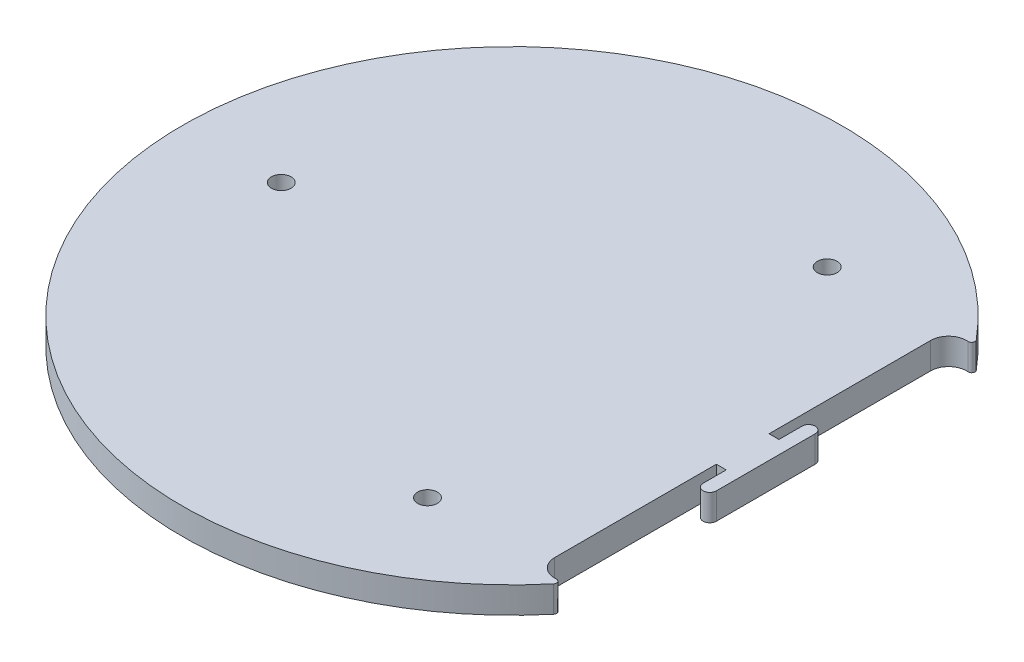
ISO-10303-21;
HEADER;
FILE_DESCRIPTION(('STEP AP214'),'2;1');
FILE_NAME('part.step','',(''),(''),'','','');
FILE_SCHEMA(('AUTOMOTIVE_DESIGN { 1 0 10303 214 1 1 1 1 }'));
ENDSEC;
DATA;
#1=APPLICATION_CONTEXT('core data for automotive mechanical design processes');
#2=APPLICATION_PROTOCOL_DEFINITION('international standard','automotive_design',2000,#1);
#3=PRODUCT_CONTEXT('',#1,'mechanical');
#4=PRODUCT('Part','Part','',(#3));
#5=PRODUCT_RELATED_PRODUCT_CATEGORY('part','',(#4));
#6=PRODUCT_DEFINITION_FORMATION('','',#4);
#7=PRODUCT_DEFINITION_CONTEXT('part definition',#1,'design');
#8=PRODUCT_DEFINITION('design','',#6,#7);
#9=PRODUCT_DEFINITION_SHAPE('','',#8);
#10=(LENGTH_UNIT() NAMED_UNIT(*) SI_UNIT(.MILLI.,.METRE.));
#11=(NAMED_UNIT(*) PLANE_ANGLE_UNIT() SI_UNIT($,.RADIAN.));
#12=(NAMED_UNIT(*) SI_UNIT($,.STERADIAN.) SOLID_ANGLE_UNIT());
#13=UNCERTAINTY_MEASURE_WITH_UNIT(LENGTH_MEASURE(1.E-05),#10,'distance_accuracy_value','');
#14=(GEOMETRIC_REPRESENTATION_CONTEXT(3) GLOBAL_UNCERTAINTY_ASSIGNED_CONTEXT((#13)) GLOBAL_UNIT_ASSIGNED_CONTEXT((#10,
#11,#12)) REPRESENTATION_CONTEXT('',''));
#15=CARTESIAN_POINT('',(0.,0.,0.));
#16=DIRECTION('',(0.,0.,1.));
#17=DIRECTION('',(1.,0.,0.));
#18=AXIS2_PLACEMENT_3D('',#15,#16,#17);
#19=CARTESIAN_POINT('',(0.,-2.,0.));
#20=DIRECTION('',(0.,1.,0.));
#21=DIRECTION('',(0.,0.,1.));
#22=AXIS2_PLACEMENT_3D('',#19,#20,#21);
#23=PLANE('',#22);
#24=DIRECTION('',(0.,0.,-1.));
#25=VECTOR('',#24,1.);
#26=CARTESIAN_POINT('',(38.5,-2.,0.));
#27=LINE('',#26,#25);
#28=CARTESIAN_POINT('',(38.5,-2.,7.5));
#29=VERTEX_POINT('',#28);
#30=CARTESIAN_POINT('',(38.5,-2.,-7.5));
#31=VERTEX_POINT('',#30);
#32=EDGE_CURVE('E168',#29,#31,#27,.T.);
#33=ORIENTED_EDGE('',*,*,#32,.F.);
#34=CARTESIAN_POINT('',(37.5,-2.,7.5));
#35=DIRECTION('',(0.,1.,0.));
#36=DIRECTION('',(0.,0.,1.));
#37=AXIS2_PLACEMENT_3D('',#34,#35,#36);
#38=CIRCLE('',#37,1.00000000000001);
#39=CARTESIAN_POINT('',(36.5,-2.,7.5));
#40=VERTEX_POINT('',#39);
#41=EDGE_CURVE('E101',#40,#29,#38,.T.);
#42=ORIENTED_EDGE('',*,*,#41,.F.);
#43=DIRECTION('',(0.,0.,-1.));
#44=VECTOR('',#43,1.);
#45=CARTESIAN_POINT('',(36.5,-2.,0.));
#46=LINE('',#45,#44);
#47=CARTESIAN_POINT('',(36.5,-2.,4.));
#48=VERTEX_POINT('',#47);
#49=EDGE_CURVE('E199',#40,#48,#46,.T.);
#50=ORIENTED_EDGE('',*,*,#49,.T.);
#51=DIRECTION('',(1.,0.,0.));
#52=VECTOR('',#51,1.);
#53=CARTESIAN_POINT('',(0.,-2.,4.));
#54=LINE('',#53,#52);
#55=CARTESIAN_POINT('',(35.,-2.,4.));
#56=VERTEX_POINT('',#55);
#57=EDGE_CURVE('E156',#56,#48,#54,.T.);
#58=ORIENTED_EDGE('',*,*,#57,.F.);
#59=DIRECTION('',(0.,0.,-1.));
#60=VECTOR('',#59,1.);
#61=CARTESIAN_POINT('',(35.,-2.,0.));
#62=LINE('',#61,#60);
#63=CARTESIAN_POINT('',(35.,-2.,28.5161138023531));
#64=VERTEX_POINT('',#63);
#65=EDGE_CURVE('E196',#64,#56,#62,.T.);
#66=ORIENTED_EDGE('',*,*,#65,.F.);
#67=CARTESIAN_POINT('',(37.7166544330073,-2.,28.5161138023531));
#68=DIRECTION('',(0.,1.,0.));
#69=DIRECTION('',(0.,0.,1.));
#70=AXIS2_PLACEMENT_3D('',#67,#68,#69);
#71=CIRCLE('',#70,2.71665443300733);
#72=CARTESIAN_POINT('',(37.9494092016024,-2.,31.2227790062664));
#73=VERTEX_POINT('',#72);
#74=EDGE_CURVE('E194',#73,#64,#71,.F.);
#75=ORIENTED_EDGE('',*,*,#74,.F.);
#76=CARTESIAN_POINT('',(37.9925630703769,-2.,31.7246079300356));
#77=DIRECTION('',(0.,1.,0.));
#78=DIRECTION('',(0.,0.,1.));
#79=AXIS2_PLACEMENT_3D('',#76,#77,#78);
#80=CIRCLE('',#79,0.503680975540726);
#81=CARTESIAN_POINT('',(38.3791803301599,-2.,32.0474416636503));
#82=VERTEX_POINT('',#81);
#83=EDGE_CURVE('E191',#73,#82,#80,.F.);
#84=ORIENTED_EDGE('',*,*,#83,.T.);
#85=CARTESIAN_POINT('',(0.,-2.,0.));
#86=DIRECTION('',(0.,1.,0.));
#87=DIRECTION('',(0.,0.,1.));
#88=AXIS2_PLACEMENT_3D('',#85,#86,#87);
#89=CIRCLE('',#88,50.);
#90=CARTESIAN_POINT('',(38.3791803301599,-2.,-32.0474416636503));
#91=VERTEX_POINT('',#90);
#92=EDGE_CURVE('E188',#91,#82,#89,.T.);
#93=ORIENTED_EDGE('',*,*,#92,.F.);
#94=CARTESIAN_POINT('',(37.9925630703769,-2.,-31.7246079300356));
#95=DIRECTION('',(0.,1.,0.));
#96=DIRECTION('',(0.,0.,1.));
#97=AXIS2_PLACEMENT_3D('',#94,#95,#96);
#98=CIRCLE('',#97,0.503680975540726);
#99=CARTESIAN_POINT('',(37.9494092016024,-2.,-31.2227790062663));
#100=VERTEX_POINT('',#99);
#101=EDGE_CURVE('E186',#100,#91,#98,.T.);
#102=ORIENTED_EDGE('',*,*,#101,.F.);
#103=CARTESIAN_POINT('',(37.7166544330073,-2.,-28.5161138023531));
#104=DIRECTION('',(0.,1.,0.));
#105=DIRECTION('',(0.,0.,1.));
#106=AXIS2_PLACEMENT_3D('',#103,#104,#105);
#107=CIRCLE('',#106,2.71665443300733);
#108=CARTESIAN_POINT('',(35.,-2.,-28.5161138023531));
#109=VERTEX_POINT('',#108);
#110=EDGE_CURVE('E183',#100,#109,#107,.T.);
#111=ORIENTED_EDGE('',*,*,#110,.T.);
#112=DIRECTION('',(0.,0.,-1.));
#113=VECTOR('',#112,1.);
#114=CARTESIAN_POINT('',(35.,-2.,0.));
#115=LINE('',#114,#113);
#116=CARTESIAN_POINT('',(35.,-2.,-4.));
#117=VERTEX_POINT('',#116);
#118=EDGE_CURVE('E180',#117,#109,#115,.T.);
#119=ORIENTED_EDGE('',*,*,#118,.F.);
#120=DIRECTION('',(1.,0.,0.));
#121=VECTOR('',#120,1.);
#122=CARTESIAN_POINT('',(0.,-2.,-4.));
#123=LINE('',#122,#121);
#124=CARTESIAN_POINT('',(36.5,-2.,-4.));
#125=VERTEX_POINT('',#124);
#126=EDGE_CURVE('E177',#117,#125,#123,.T.);
#127=ORIENTED_EDGE('',*,*,#126,.T.);
#128=DIRECTION('',(0.,0.,1.));
#129=VECTOR('',#128,1.);
#130=CARTESIAN_POINT('',(36.5,-2.,0.));
#131=LINE('',#130,#129);
#132=CARTESIAN_POINT('',(36.5,-2.,-7.5));
#133=VERTEX_POINT('',#132);
#134=EDGE_CURVE('E174',#133,#125,#131,.T.);
#135=ORIENTED_EDGE('',*,*,#134,.F.);
#136=CARTESIAN_POINT('',(37.5,-2.,-7.5));
#137=DIRECTION('',(0.,1.,0.));
#138=DIRECTION('',(0.,0.,1.));
#139=AXIS2_PLACEMENT_3D('',#136,#137,#138);
#140=CIRCLE('',#139,1.00000000000001);
#141=EDGE_CURVE('E171',#31,#133,#140,.T.);
#142=ORIENTED_EDGE('',*,*,#141,.F.);
#143=EDGE_LOOP('',(#33,#42,#50,#58,#66,#75,#84,#93,#102,#111,#119,#127,#135,#142));
#144=FACE_BOUND('',#143,.T.);
#145=CARTESIAN_POINT('',(-35.,-2.,0.));
#146=DIRECTION('',(0.,1.,0.));
#147=DIRECTION('',(0.,0.,1.));
#148=AXIS2_PLACEMENT_3D('',#145,#146,#147);
#149=CIRCLE('',#148,4.);
#150=CARTESIAN_POINT('',(-35.,-2.,4.));
#151=VERTEX_POINT('',#150);
#152=EDGE_CURVE('E229',#151,#151,#149,.F.);
#153=ORIENTED_EDGE('',*,*,#152,.F.);
#154=EDGE_LOOP('',(#153));
#155=FACE_BOUND('',#154,.T.);
#156=CARTESIAN_POINT('',(17.5,-2.,30.3108891324554));
#157=DIRECTION('',(0.,1.,0.));
#158=DIRECTION('',(0.,0.,1.));
#159=AXIS2_PLACEMENT_3D('',#156,#157,#158);
#160=CIRCLE('',#159,4.);
#161=CARTESIAN_POINT('',(17.5,-2.,34.3108891324554));
#162=VERTEX_POINT('',#161);
#163=EDGE_CURVE('E44',#162,#162,#160,.F.);
#164=ORIENTED_EDGE('',*,*,#163,.F.);
#165=EDGE_LOOP('',(#164));
#166=FACE_BOUND('',#165,.T.);
#167=CARTESIAN_POINT('',(17.5,-2.,-30.3108891324554));
#168=DIRECTION('',(0.,1.,0.));
#169=DIRECTION('',(0.,0.,1.));
#170=AXIS2_PLACEMENT_3D('',#167,#168,#169);
#171=CIRCLE('',#170,4.);
#172=CARTESIAN_POINT('',(17.5,-2.,-26.3108891324553));
#173=VERTEX_POINT('',#172);
#174=EDGE_CURVE('E11',#173,#173,#171,.F.);
#175=ORIENTED_EDGE('',*,*,#174,.F.);
#176=EDGE_LOOP('',(#175));
#177=FACE_BOUND('',#176,.T.);
#178=ADVANCED_FACE('F35',(#144,#155,#166,#177),#23,.F.);
#179=CARTESIAN_POINT('',(17.5,-2.,-30.3108891324554));
#180=DIRECTION('',(0.,-1.,0.));
#181=DIRECTION('',(0.,0.,-1.));
#182=AXIS2_PLACEMENT_3D('',#179,#180,#181);
#183=CIRCLE('',#182,3.);
#184=CARTESIAN_POINT('',(17.5,-2.,-33.3108891324554));
#185=VERTEX_POINT('',#184);
#186=EDGE_CURVE('E426',#185,#185,#183,.T.);
#187=ORIENTED_EDGE('',*,*,#186,.T.);
#188=EDGE_LOOP('',(#187));
#189=FACE_BOUND('',#188,.T.);
#190=CARTESIAN_POINT('',(17.5,-2.,-30.3108891324554));
#191=DIRECTION('',(0.,-1.,0.));
#192=DIRECTION('',(0.,0.,-1.));
#193=AXIS2_PLACEMENT_3D('',#190,#191,#192);
#194=CIRCLE('',#193,1.5);
#195=CARTESIAN_POINT('',(17.5,-2.,-31.8108891324553));
#196=VERTEX_POINT('',#195);
#197=EDGE_CURVE('E395',#196,#196,#194,.T.);
#198=ORIENTED_EDGE('',*,*,#197,.F.);
#199=EDGE_LOOP('',(#198));
#200=FACE_BOUND('',#199,.T.);
#201=ADVANCED_FACE('F238',(#189,#200),#23,.F.);
#202=CARTESIAN_POINT('',(17.5,-2.,30.3108891324554));
#203=DIRECTION('',(0.,-1.,0.));
#204=DIRECTION('',(0.,0.,-1.));
#205=AXIS2_PLACEMENT_3D('',#202,#203,#204);
#206=CIRCLE('',#205,2.99999999999999);
#207=CARTESIAN_POINT('',(17.5,-2.,27.3108891324554));
#208=VERTEX_POINT('',#207);
#209=EDGE_CURVE('E417',#208,#208,#206,.T.);
#210=ORIENTED_EDGE('',*,*,#209,.T.);
#211=EDGE_LOOP('',(#210));
#212=FACE_BOUND('',#211,.T.);
#213=CARTESIAN_POINT('',(17.5,-2.,30.3108891324554));
#214=DIRECTION('',(0.,-1.,0.));
#215=DIRECTION('',(0.,0.,-1.));
#216=AXIS2_PLACEMENT_3D('',#213,#214,#215);
#217=CIRCLE('',#216,1.5);
#218=CARTESIAN_POINT('',(17.5,-2.,28.8108891324554));
#219=VERTEX_POINT('',#218);
#220=EDGE_CURVE('E401',#219,#219,#217,.T.);
#221=ORIENTED_EDGE('',*,*,#220,.F.);
#222=EDGE_LOOP('',(#221));
#223=FACE_BOUND('',#222,.T.);
#224=ADVANCED_FACE('F301',(#212,#223),#23,.F.);
#225=CARTESIAN_POINT('',(38.5,2.,0.));
#226=DIRECTION('',(-1.,0.,0.));
#227=DIRECTION('',(0.,0.,1.));
#228=AXIS2_PLACEMENT_3D('',#225,#226,#227);
#229=PLANE('',#228);
#230=ORIENTED_EDGE('',*,*,#32,.T.);
#231=DIRECTION('',(0.,-1.,0.));
#232=VECTOR('',#231,1.);
#233=CARTESIAN_POINT('',(38.5,2.,-7.5));
#234=LINE('',#233,#232);
#235=CARTESIAN_POINT('',(38.5,2.,-7.5));
#236=VERTEX_POINT('',#235);
#237=EDGE_CURVE('E227',#236,#31,#234,.T.);
#238=ORIENTED_EDGE('',*,*,#237,.F.);
#239=DIRECTION('',(0.,0.,-1.));
#240=VECTOR('',#239,1.);
#241=CARTESIAN_POINT('',(38.5,2.,0.));
#242=LINE('',#241,#240);
#243=CARTESIAN_POINT('',(38.5,2.,7.5));
#244=VERTEX_POINT('',#243);
#245=EDGE_CURVE('E202',#244,#236,#242,.T.);
#246=ORIENTED_EDGE('',*,*,#245,.F.);
#247=DIRECTION('',(0.,-1.,0.));
#248=VECTOR('',#247,1.);
#249=CARTESIAN_POINT('',(38.5,2.,7.5));
#250=LINE('',#249,#248);
#251=EDGE_CURVE('E164',#244,#29,#250,.T.);
#252=ORIENTED_EDGE('',*,*,#251,.T.);
#253=EDGE_LOOP('',(#230,#238,#246,#252));
#254=FACE_BOUND('',#253,.T.);
#255=ADVANCED_FACE('F37',(#254),#229,.F.);
#256=CARTESIAN_POINT('',(37.5,2.,-7.5));
#257=DIRECTION('',(0.,-1.,0.));
#258=DIRECTION('',(0.,0.,-1.));
#259=AXIS2_PLACEMENT_3D('',#256,#257,#258);
#260=CYLINDRICAL_SURFACE('',#259,1.00000000000001);
#261=ORIENTED_EDGE('',*,*,#141,.T.);
#262=DIRECTION('',(0.,-1.,0.));
#263=VECTOR('',#262,1.);
#264=CARTESIAN_POINT('',(36.5,2.,-7.5));
#265=LINE('',#264,#263);
#266=CARTESIAN_POINT('',(36.5,2.,-7.5));
#267=VERTEX_POINT('',#266);
#268=EDGE_CURVE('E224',#267,#133,#265,.T.);
#269=ORIENTED_EDGE('',*,*,#268,.F.);
#270=CARTESIAN_POINT('',(37.5,2.,-7.5));
#271=DIRECTION('',(0.,1.,0.));
#272=DIRECTION('',(0.,0.,1.));
#273=AXIS2_PLACEMENT_3D('',#270,#271,#272);
#274=CIRCLE('',#273,1.00000000000001);
#275=EDGE_CURVE('E110',#236,#267,#274,.T.);
#276=ORIENTED_EDGE('',*,*,#275,.F.);
#277=ORIENTED_EDGE('',*,*,#237,.T.);
#278=EDGE_LOOP('',(#261,#269,#276,#277));
#279=FACE_BOUND('',#278,.T.);
#280=ADVANCED_FACE('F342',(#279),#260,.T.);
#281=CARTESIAN_POINT('',(36.5,2.,0.));
#282=DIRECTION('',(1.,0.,0.));
#283=DIRECTION('',(0.,0.,-1.));
#284=AXIS2_PLACEMENT_3D('',#281,#282,#283);
#285=PLANE('',#284);
#286=ORIENTED_EDGE('',*,*,#134,.T.);
#287=DIRECTION('',(0.,-1.,0.));
#288=VECTOR('',#287,1.);
#289=CARTESIAN_POINT('',(36.5,2.,-4.));
#290=LINE('',#289,#288);
#291=CARTESIAN_POINT('',(36.5,2.,-4.));
#292=VERTEX_POINT('',#291);
#293=EDGE_CURVE('E222',#292,#125,#290,.T.);
#294=ORIENTED_EDGE('',*,*,#293,.F.);
#295=DIRECTION('',(0.,0.,1.));
#296=VECTOR('',#295,1.);
#297=CARTESIAN_POINT('',(36.5,2.,0.));
#298=LINE('',#297,#296);
#299=EDGE_CURVE('E354',#267,#292,#298,.T.);
#300=ORIENTED_EDGE('',*,*,#299,.F.);
#301=ORIENTED_EDGE('',*,*,#268,.T.);
#302=EDGE_LOOP('',(#286,#294,#300,#301));
#303=FACE_BOUND('',#302,.T.);
#304=ADVANCED_FACE('F339',(#303),#285,.F.);
#305=CARTESIAN_POINT('',(0.,2.,-4.));
#306=DIRECTION('',(0.,0.,-1.));
#307=DIRECTION('',(-1.,0.,0.));
#308=AXIS2_PLACEMENT_3D('',#305,#306,#307);
#309=PLANE('',#308);
#310=ORIENTED_EDGE('',*,*,#126,.F.);
#311=DIRECTION('',(0.,-1.,0.));
#312=VECTOR('',#311,1.);
#313=CARTESIAN_POINT('',(35.,2.,-4.));
#314=LINE('',#313,#312);
#315=CARTESIAN_POINT('',(35.,2.,-4.));
#316=VERTEX_POINT('',#315);
#317=EDGE_CURVE('E220',#316,#117,#314,.T.);
#318=ORIENTED_EDGE('',*,*,#317,.F.);
#319=DIRECTION('',(1.,0.,0.));
#320=VECTOR('',#319,1.);
#321=CARTESIAN_POINT('',(0.,2.,-4.));
#322=LINE('',#321,#320);
#323=EDGE_CURVE('E361',#316,#292,#322,.T.);
#324=ORIENTED_EDGE('',*,*,#323,.T.);
#325=ORIENTED_EDGE('',*,*,#293,.T.);
#326=EDGE_LOOP('',(#310,#318,#324,#325));
#327=FACE_BOUND('',#326,.T.);
#328=ADVANCED_FACE('F335',(#327),#309,.T.);
#329=CARTESIAN_POINT('',(35.,2.,0.));
#330=DIRECTION('',(-1.,0.,0.));
#331=DIRECTION('',(0.,0.,1.));
#332=AXIS2_PLACEMENT_3D('',#329,#330,#331);
#333=PLANE('',#332);
#334=ORIENTED_EDGE('',*,*,#118,.T.);
#335=DIRECTION('',(0.,-1.,0.));
#336=VECTOR('',#335,1.);
#337=CARTESIAN_POINT('',(35.,2.,-28.5161138023531));
#338=LINE('',#337,#336);
#339=CARTESIAN_POINT('',(35.,2.,-28.5161138023531));
#340=VERTEX_POINT('',#339);
#341=EDGE_CURVE('E218',#340,#109,#338,.T.);
#342=ORIENTED_EDGE('',*,*,#341,.F.);
#343=DIRECTION('',(0.,0.,-1.));
#344=VECTOR('',#343,1.);
#345=CARTESIAN_POINT('',(35.,2.,0.));
#346=LINE('',#345,#344);
#347=EDGE_CURVE('E362',#316,#340,#346,.T.);
#348=ORIENTED_EDGE('',*,*,#347,.F.);
#349=ORIENTED_EDGE('',*,*,#317,.T.);
#350=EDGE_LOOP('',(#334,#342,#348,#349));
#351=FACE_BOUND('',#350,.T.);
#352=ADVANCED_FACE('F331',(#351),#333,.F.);
#353=CARTESIAN_POINT('',(37.7166544330073,2.,-28.5161138023531));
#354=DIRECTION('',(0.,-1.,0.));
#355=DIRECTION('',(0.,0.,-1.));
#356=AXIS2_PLACEMENT_3D('',#353,#354,#355);
#357=CYLINDRICAL_SURFACE('',#356,2.71665443300733);
#358=ORIENTED_EDGE('',*,*,#110,.F.);
#359=DIRECTION('',(0.,-1.,0.));
#360=VECTOR('',#359,1.);
#361=CARTESIAN_POINT('',(37.9494092016024,2.,-31.2227790062663));
#362=LINE('',#361,#360);
#363=CARTESIAN_POINT('',(37.9494092016024,2.,-31.2227790062663));
#364=VERTEX_POINT('',#363);
#365=EDGE_CURVE('E216',#364,#100,#362,.T.);
#366=ORIENTED_EDGE('',*,*,#365,.F.);
#367=CARTESIAN_POINT('',(37.7166544330073,2.,-28.5161138023531));
#368=DIRECTION('',(0.,1.,0.));
#369=DIRECTION('',(0.,0.,1.));
#370=AXIS2_PLACEMENT_3D('',#367,#368,#369);
#371=CIRCLE('',#370,2.71665443300733);
#372=EDGE_CURVE('E364',#364,#340,#371,.T.);
#373=ORIENTED_EDGE('',*,*,#372,.T.);
#374=ORIENTED_EDGE('',*,*,#341,.T.);
#375=EDGE_LOOP('',(#358,#366,#373,#374));
#376=FACE_BOUND('',#375,.T.);
#377=ADVANCED_FACE('F327',(#376),#357,.F.);
#378=CARTESIAN_POINT('',(37.9925630703769,2.,-31.7246079300356));
#379=DIRECTION('',(0.,-1.,0.));
#380=DIRECTION('',(0.,0.,-1.));
#381=AXIS2_PLACEMENT_3D('',#378,#379,#380);
#382=CYLINDRICAL_SURFACE('',#381,0.503680975540726);
#383=ORIENTED_EDGE('',*,*,#101,.T.);
#384=DIRECTION('',(0.,-1.,0.));
#385=VECTOR('',#384,1.);
#386=CARTESIAN_POINT('',(38.3791803301599,2.,-32.0474416636503));
#387=LINE('',#386,#385);
#388=CARTESIAN_POINT('',(38.3791803301599,2.,-32.0474416636503));
#389=VERTEX_POINT('',#388);
#390=EDGE_CURVE('E213',#389,#91,#387,.T.);
#391=ORIENTED_EDGE('',*,*,#390,.F.);
#392=CARTESIAN_POINT('',(37.9925630703769,2.,-31.7246079300356));
#393=DIRECTION('',(0.,1.,0.));
#394=DIRECTION('',(0.,0.,1.));
#395=AXIS2_PLACEMENT_3D('',#392,#393,#394);
#396=CIRCLE('',#395,0.503680975540726);
#397=EDGE_CURVE('E371',#364,#389,#396,.T.);
#398=ORIENTED_EDGE('',*,*,#397,.F.);
#399=ORIENTED_EDGE('',*,*,#365,.T.);
#400=EDGE_LOOP('',(#383,#391,#398,#399));
#401=FACE_BOUND('',#400,.T.);
#402=ADVANCED_FACE('F323',(#401),#382,.T.);
#403=CARTESIAN_POINT('',(0.,2.,0.));
#404=DIRECTION('',(0.,-1.,0.));
#405=DIRECTION('',(0.,0.,-1.));
#406=AXIS2_PLACEMENT_3D('',#403,#404,#405);
#407=CYLINDRICAL_SURFACE('',#406,50.);
#408=ORIENTED_EDGE('',*,*,#92,.T.);
#409=DIRECTION('',(0.,-1.,0.));
#410=VECTOR('',#409,1.);
#411=CARTESIAN_POINT('',(38.3791803301599,2.,32.0474416636503));
#412=LINE('',#411,#410);
#413=CARTESIAN_POINT('',(38.3791803301599,2.,32.0474416636503));
#414=VERTEX_POINT('',#413);
#415=EDGE_CURVE('E211',#414,#82,#412,.T.);
#416=ORIENTED_EDGE('',*,*,#415,.F.);
#417=CARTESIAN_POINT('',(0.,2.,0.));
#418=DIRECTION('',(0.,1.,0.));
#419=DIRECTION('',(0.,0.,1.));
#420=AXIS2_PLACEMENT_3D('',#417,#418,#419);
#421=CIRCLE('',#420,50.);
#422=EDGE_CURVE('E373',#389,#414,#421,.T.);
#423=ORIENTED_EDGE('',*,*,#422,.F.);
#424=ORIENTED_EDGE('',*,*,#390,.T.);
#425=EDGE_LOOP('',(#408,#416,#423,#424));
#426=FACE_BOUND('',#425,.T.);
#427=ADVANCED_FACE('F319',(#426),#407,.T.);
#428=CARTESIAN_POINT('',(37.9925630703769,2.,31.7246079300356));
#429=DIRECTION('',(0.,-1.,0.));
#430=DIRECTION('',(0.,0.,-1.));
#431=AXIS2_PLACEMENT_3D('',#428,#429,#430);
#432=CYLINDRICAL_SURFACE('',#431,0.503680975540726);
#433=ORIENTED_EDGE('',*,*,#83,.F.);
#434=DIRECTION('',(0.,-1.,0.));
#435=VECTOR('',#434,1.);
#436=CARTESIAN_POINT('',(37.9494092016024,2.,31.2227790062664));
#437=LINE('',#436,#435);
#438=CARTESIAN_POINT('',(37.9494092016024,2.,31.2227790062664));
#439=VERTEX_POINT('',#438);
#440=EDGE_CURVE('E209',#439,#73,#437,.T.);
#441=ORIENTED_EDGE('',*,*,#440,.F.);
#442=CARTESIAN_POINT('',(37.9925630703769,2.,31.7246079300356));
#443=DIRECTION('',(0.,1.,0.));
#444=DIRECTION('',(0.,0.,1.));
#445=AXIS2_PLACEMENT_3D('',#442,#443,#444);
#446=CIRCLE('',#445,0.503680975540726);
#447=EDGE_CURVE('E375',#439,#414,#446,.F.);
#448=ORIENTED_EDGE('',*,*,#447,.T.);
#449=ORIENTED_EDGE('',*,*,#415,.T.);
#450=EDGE_LOOP('',(#433,#441,#448,#449));
#451=FACE_BOUND('',#450,.T.);
#452=ADVANCED_FACE('F315',(#451),#432,.T.);
#453=CARTESIAN_POINT('',(37.7166544330073,2.,28.5161138023531));
#454=DIRECTION('',(0.,-1.,0.));
#455=DIRECTION('',(0.,0.,-1.));
#456=AXIS2_PLACEMENT_3D('',#453,#454,#455);
#457=CYLINDRICAL_SURFACE('',#456,2.71665443300733);
#458=ORIENTED_EDGE('',*,*,#74,.T.);
#459=DIRECTION('',(0.,-1.,0.));
#460=VECTOR('',#459,1.);
#461=CARTESIAN_POINT('',(35.,2.,28.5161138023531));
#462=LINE('',#461,#460);
#463=CARTESIAN_POINT('',(35.,2.,28.5161138023531));
#464=VERTEX_POINT('',#463);
#465=EDGE_CURVE('E206',#464,#64,#462,.T.);
#466=ORIENTED_EDGE('',*,*,#465,.F.);
#467=CARTESIAN_POINT('',(37.7166544330073,2.,28.5161138023531));
#468=DIRECTION('',(0.,1.,0.));
#469=DIRECTION('',(0.,0.,1.));
#470=AXIS2_PLACEMENT_3D('',#467,#468,#469);
#471=CIRCLE('',#470,2.71665443300733);
#472=EDGE_CURVE('E378',#439,#464,#471,.F.);
#473=ORIENTED_EDGE('',*,*,#472,.F.);
#474=ORIENTED_EDGE('',*,*,#440,.T.);
#475=EDGE_LOOP('',(#458,#466,#473,#474));
#476=FACE_BOUND('',#475,.T.);
#477=ADVANCED_FACE('F311',(#476),#457,.F.);
#478=CARTESIAN_POINT('',(35.,2.,0.));
#479=DIRECTION('',(-1.,0.,0.));
#480=DIRECTION('',(0.,0.,1.));
#481=AXIS2_PLACEMENT_3D('',#478,#479,#480);
#482=PLANE('',#481);
#483=ORIENTED_EDGE('',*,*,#65,.T.);
#484=DIRECTION('',(0.,-1.,0.));
#485=VECTOR('',#484,1.);
#486=CARTESIAN_POINT('',(35.,2.,4.));
#487=LINE('',#486,#485);
#488=CARTESIAN_POINT('',(35.,2.,4.));
#489=VERTEX_POINT('',#488);
#490=EDGE_CURVE('E160',#489,#56,#487,.T.);
#491=ORIENTED_EDGE('',*,*,#490,.F.);
#492=DIRECTION('',(0.,0.,-1.));
#493=VECTOR('',#492,1.);
#494=CARTESIAN_POINT('',(35.,2.,0.));
#495=LINE('',#494,#493);
#496=EDGE_CURVE('E147',#464,#489,#495,.T.);
#497=ORIENTED_EDGE('',*,*,#496,.F.);
#498=ORIENTED_EDGE('',*,*,#465,.T.);
#499=EDGE_LOOP('',(#483,#491,#497,#498));
#500=FACE_BOUND('',#499,.T.);
#501=ADVANCED_FACE('F308',(#500),#482,.F.);
#502=CARTESIAN_POINT('',(0.,2.,4.));
#503=DIRECTION('',(0.,0.,-1.));
#504=DIRECTION('',(-1.,0.,0.));
#505=AXIS2_PLACEMENT_3D('',#502,#503,#504);
#506=PLANE('',#505);
#507=ORIENTED_EDGE('',*,*,#57,.T.);
#508=DIRECTION('',(0.,-1.,0.));
#509=VECTOR('',#508,1.);
#510=CARTESIAN_POINT('',(36.5,2.,4.));
#511=LINE('',#510,#509);
#512=CARTESIAN_POINT('',(36.5,2.,4.));
#513=VERTEX_POINT('',#512);
#514=EDGE_CURVE('E153',#513,#48,#511,.T.);
#515=ORIENTED_EDGE('',*,*,#514,.F.);
#516=DIRECTION('',(1.,0.,0.));
#517=VECTOR('',#516,1.);
#518=CARTESIAN_POINT('',(0.,2.,4.));
#519=LINE('',#518,#517);
#520=EDGE_CURVE('E141',#489,#513,#519,.T.);
#521=ORIENTED_EDGE('',*,*,#520,.F.);
#522=ORIENTED_EDGE('',*,*,#490,.T.);
#523=EDGE_LOOP('',(#507,#515,#521,#522));
#524=FACE_BOUND('',#523,.T.);
#525=ADVANCED_FACE('F154',(#524),#506,.F.);
#526=CARTESIAN_POINT('',(36.5,2.,0.));
#527=DIRECTION('',(-1.,0.,0.));
#528=DIRECTION('',(0.,0.,1.));
#529=AXIS2_PLACEMENT_3D('',#526,#527,#528);
#530=PLANE('',#529);
#531=ORIENTED_EDGE('',*,*,#49,.F.);
#532=DIRECTION('',(0.,-1.,0.));
#533=VECTOR('',#532,1.);
#534=CARTESIAN_POINT('',(36.5,2.,7.5));
#535=LINE('',#534,#533);
#536=CARTESIAN_POINT('',(36.5,2.,7.5));
#537=VERTEX_POINT('',#536);
#538=EDGE_CURVE('E98',#537,#40,#535,.T.);
#539=ORIENTED_EDGE('',*,*,#538,.F.);
#540=DIRECTION('',(0.,0.,-1.));
#541=VECTOR('',#540,1.);
#542=CARTESIAN_POINT('',(36.5,2.,0.));
#543=LINE('',#542,#541);
#544=EDGE_CURVE('E145',#537,#513,#543,.T.);
#545=ORIENTED_EDGE('',*,*,#544,.T.);
#546=ORIENTED_EDGE('',*,*,#514,.T.);
#547=EDGE_LOOP('',(#531,#539,#545,#546));
#548=FACE_BOUND('',#547,.T.);
#549=ADVANCED_FACE('F162',(#548),#530,.T.);
#550=CARTESIAN_POINT('',(37.5,2.,7.5));
#551=DIRECTION('',(0.,-1.,0.));
#552=DIRECTION('',(0.,0.,-1.));
#553=AXIS2_PLACEMENT_3D('',#550,#551,#552);
#554=CYLINDRICAL_SURFACE('',#553,1.00000000000001);
#555=ORIENTED_EDGE('',*,*,#41,.T.);
#556=ORIENTED_EDGE('',*,*,#251,.F.);
#557=CARTESIAN_POINT('',(37.5,2.,7.5));
#558=DIRECTION('',(0.,1.,0.));
#559=DIRECTION('',(0.,0.,1.));
#560=AXIS2_PLACEMENT_3D('',#557,#558,#559);
#561=CIRCLE('',#560,1.00000000000001);
#562=EDGE_CURVE('E52',#537,#244,#561,.T.);
#563=ORIENTED_EDGE('',*,*,#562,.F.);
#564=ORIENTED_EDGE('',*,*,#538,.T.);
#565=EDGE_LOOP('',(#555,#556,#563,#564));
#566=FACE_BOUND('',#565,.T.);
#567=ADVANCED_FACE('F296',(#566),#554,.T.);
#568=CARTESIAN_POINT('',(0.,2.,0.));
#569=DIRECTION('',(0.,1.,0.));
#570=DIRECTION('',(0.,0.,1.));
#571=AXIS2_PLACEMENT_3D('',#568,#569,#570);
#572=PLANE('',#571);
#573=CARTESIAN_POINT('',(17.5,2.,30.3108891324554));
#574=DIRECTION('',(0.,1.,0.));
#575=DIRECTION('',(0.,0.,1.));
#576=AXIS2_PLACEMENT_3D('',#573,#574,#575);
#577=CIRCLE('',#576,1.5);
#578=CARTESIAN_POINT('',(17.5,2.,31.8108891324554));
#579=VERTEX_POINT('',#578);
#580=EDGE_CURVE('E398',#579,#579,#577,.T.);
#581=ORIENTED_EDGE('',*,*,#580,.F.);
#582=EDGE_LOOP('',(#581));
#583=FACE_BOUND('',#582,.T.);
#584=CARTESIAN_POINT('',(17.5,2.,-30.3108891324554));
#585=DIRECTION('',(0.,1.,0.));
#586=DIRECTION('',(0.,0.,1.));
#587=AXIS2_PLACEMENT_3D('',#584,#585,#586);
#588=CIRCLE('',#587,1.5);
#589=CARTESIAN_POINT('',(17.5,2.,-28.8108891324553));
#590=VERTEX_POINT('',#589);
#591=EDGE_CURVE('E392',#590,#590,#588,.T.);
#592=ORIENTED_EDGE('',*,*,#591,.F.);
#593=EDGE_LOOP('',(#592));
#594=FACE_BOUND('',#593,.T.);
#595=CARTESIAN_POINT('',(-35.,2.,0.));
#596=DIRECTION('',(0.,1.,0.));
#597=DIRECTION('',(0.,0.,1.));
#598=AXIS2_PLACEMENT_3D('',#595,#596,#597);
#599=CIRCLE('',#598,1.5);
#600=CARTESIAN_POINT('',(-35.,2.,1.50000000000001));
#601=VERTEX_POINT('',#600);
#602=EDGE_CURVE('E172',#601,#601,#599,.T.);
#603=ORIENTED_EDGE('',*,*,#602,.F.);
#604=EDGE_LOOP('',(#603));
#605=FACE_BOUND('',#604,.T.);
#606=ORIENTED_EDGE('',*,*,#245,.T.);
#607=ORIENTED_EDGE('',*,*,#275,.T.);
#608=ORIENTED_EDGE('',*,*,#299,.T.);
#609=ORIENTED_EDGE('',*,*,#323,.F.);
#610=ORIENTED_EDGE('',*,*,#347,.T.);
#611=ORIENTED_EDGE('',*,*,#372,.F.);
#612=ORIENTED_EDGE('',*,*,#397,.T.);
#613=ORIENTED_EDGE('',*,*,#422,.T.);
#614=ORIENTED_EDGE('',*,*,#447,.F.);
#615=ORIENTED_EDGE('',*,*,#472,.T.);
#616=ORIENTED_EDGE('',*,*,#496,.T.);
#617=ORIENTED_EDGE('',*,*,#520,.T.);
#618=ORIENTED_EDGE('',*,*,#544,.F.);
#619=ORIENTED_EDGE('',*,*,#562,.T.);
#620=EDGE_LOOP('',(#606,#607,#608,#609,#610,#611,#612,#613,#614,#615,#616,#617,#618,#619));
#621=FACE_BOUND('',#620,.T.);
#622=ADVANCED_FACE('F143',(#583,#594,#605,#621),#572,.T.);
#623=CARTESIAN_POINT('',(-35.,-2.,0.));
#624=DIRECTION('',(0.,-1.,0.));
#625=DIRECTION('',(0.,0.,-1.));
#626=AXIS2_PLACEMENT_3D('',#623,#624,#625);
#627=CIRCLE('',#626,2.99999999999999);
#628=CARTESIAN_POINT('',(-35.,-2.,-2.99999999999999));
#629=VERTEX_POINT('',#628);
#630=EDGE_CURVE('E408',#629,#629,#627,.T.);
#631=ORIENTED_EDGE('',*,*,#630,.T.);
#632=EDGE_LOOP('',(#631));
#633=FACE_BOUND('',#632,.T.);
#634=CARTESIAN_POINT('',(-35.,-2.,0.));
#635=DIRECTION('',(0.,-1.,0.));
#636=DIRECTION('',(0.,0.,-1.));
#637=AXIS2_PLACEMENT_3D('',#634,#635,#636);
#638=CIRCLE('',#637,1.5);
#639=CARTESIAN_POINT('',(-35.,-2.,-1.5));
#640=VERTEX_POINT('',#639);
#641=EDGE_CURVE('E389',#640,#640,#638,.T.);
#642=ORIENTED_EDGE('',*,*,#641,.F.);
#643=EDGE_LOOP('',(#642));
#644=FACE_BOUND('',#643,.T.);
#645=ADVANCED_FACE('F241',(#633,#644),#23,.F.);
#646=CARTESIAN_POINT('',(-35.,5.,0.));
#647=DIRECTION('',(0.,-1.,0.));
#648=DIRECTION('',(0.,0.,-1.));
#649=AXIS2_PLACEMENT_3D('',#646,#647,#648);
#650=CYLINDRICAL_SURFACE('',#649,1.5);
#651=ORIENTED_EDGE('',*,*,#602,.T.);
#652=EDGE_LOOP('',(#651));
#653=FACE_BOUND('',#652,.T.);
#654=ORIENTED_EDGE('',*,*,#641,.T.);
#655=EDGE_LOOP('',(#654));
#656=FACE_BOUND('',#655,.T.);
#657=ADVANCED_FACE('F290',(#653,#656),#650,.F.);
#658=CARTESIAN_POINT('',(17.5,5.,-30.3108891324554));
#659=DIRECTION('',(0.,-1.,0.));
#660=DIRECTION('',(0.,0.,-1.));
#661=AXIS2_PLACEMENT_3D('',#658,#659,#660);
#662=CYLINDRICAL_SURFACE('',#661,1.5);
#663=ORIENTED_EDGE('',*,*,#591,.T.);
#664=EDGE_LOOP('',(#663));
#665=FACE_BOUND('',#664,.T.);
#666=ORIENTED_EDGE('',*,*,#197,.T.);
#667=EDGE_LOOP('',(#666));
#668=FACE_BOUND('',#667,.T.);
#669=ADVANCED_FACE('F286',(#665,#668),#662,.F.);
#670=CARTESIAN_POINT('',(17.5,5.,30.3108891324554));
#671=DIRECTION('',(0.,-1.,0.));
#672=DIRECTION('',(0.,0.,-1.));
#673=AXIS2_PLACEMENT_3D('',#670,#671,#672);
#674=CYLINDRICAL_SURFACE('',#673,1.5);
#675=ORIENTED_EDGE('',*,*,#580,.T.);
#676=EDGE_LOOP('',(#675));
#677=FACE_BOUND('',#676,.T.);
#678=ORIENTED_EDGE('',*,*,#220,.T.);
#679=EDGE_LOOP('',(#678));
#680=FACE_BOUND('',#679,.T.);
#681=ADVANCED_FACE('F279',(#677,#680),#674,.F.);
#682=CARTESIAN_POINT('',(-35.,-7.,0.));
#683=DIRECTION('',(0.,-1.,0.));
#684=DIRECTION('',(0.,0.,-1.));
#685=AXIS2_PLACEMENT_3D('',#682,#683,#684);
#686=PLANE('',#685);
#687=CARTESIAN_POINT('',(-35.,-7.,0.));
#688=DIRECTION('',(0.,-1.,0.));
#689=DIRECTION('',(0.,0.,-1.));
#690=AXIS2_PLACEMENT_3D('',#687,#688,#689);
#691=CIRCLE('',#690,4.);
#692=CARTESIAN_POINT('',(-35.,-7.,-3.99999999999999));
#693=VERTEX_POINT('',#692);
#694=EDGE_CURVE('E404',#693,#693,#691,.T.);
#695=ORIENTED_EDGE('',*,*,#694,.T.);
#696=EDGE_LOOP('',(#695));
#697=FACE_BOUND('',#696,.T.);
#698=CARTESIAN_POINT('',(-35.,-7.,0.));
#699=DIRECTION('',(0.,-1.,0.));
#700=DIRECTION('',(0.,0.,-1.));
#701=AXIS2_PLACEMENT_3D('',#698,#699,#700);
#702=CIRCLE('',#701,2.99999999999999);
#703=CARTESIAN_POINT('',(-35.,-7.,-2.99999999999999));
#704=VERTEX_POINT('',#703);
#705=EDGE_CURVE('E407',#704,#704,#702,.T.);
#706=ORIENTED_EDGE('',*,*,#705,.F.);
#707=EDGE_LOOP('',(#706));
#708=FACE_BOUND('',#707,.T.);
#709=ADVANCED_FACE('F276',(#697,#708),#686,.T.);
#710=CARTESIAN_POINT('',(-35.,-7.,0.));
#711=DIRECTION('',(0.,1.,0.));
#712=DIRECTION('',(0.,0.,1.));
#713=AXIS2_PLACEMENT_3D('',#710,#711,#712);
#714=CYLINDRICAL_SURFACE('',#713,4.);
#715=ORIENTED_EDGE('',*,*,#694,.F.);
#716=EDGE_LOOP('',(#715));
#717=FACE_BOUND('',#716,.T.);
#718=ORIENTED_EDGE('',*,*,#152,.T.);
#719=EDGE_LOOP('',(#718));
#720=FACE_BOUND('',#719,.T.);
#721=ADVANCED_FACE('F274',(#717,#720),#714,.T.);
#722=CARTESIAN_POINT('',(-35.,-7.,0.));
#723=DIRECTION('',(0.,1.,0.));
#724=DIRECTION('',(0.,0.,1.));
#725=AXIS2_PLACEMENT_3D('',#722,#723,#724);
#726=CYLINDRICAL_SURFACE('',#725,2.99999999999999);
#727=ORIENTED_EDGE('',*,*,#705,.T.);
#728=EDGE_LOOP('',(#727));
#729=FACE_BOUND('',#728,.T.);
#730=ORIENTED_EDGE('',*,*,#630,.F.);
#731=EDGE_LOOP('',(#730));
#732=FACE_BOUND('',#731,.T.);
#733=ADVANCED_FACE('F267',(#729,#732),#726,.F.);
#734=CARTESIAN_POINT('',(17.5,-7.,30.3108891324554));
#735=DIRECTION('',(0.,-1.,0.));
#736=DIRECTION('',(0.,0.,-1.));
#737=AXIS2_PLACEMENT_3D('',#734,#735,#736);
#738=PLANE('',#737);
#739=CARTESIAN_POINT('',(17.5,-7.,30.3108891324554));
#740=DIRECTION('',(0.,-1.,0.));
#741=DIRECTION('',(0.,0.,-1.));
#742=AXIS2_PLACEMENT_3D('',#739,#740,#741);
#743=CIRCLE('',#742,4.);
#744=CARTESIAN_POINT('',(17.5,-7.,26.3108891324554));
#745=VERTEX_POINT('',#744);
#746=EDGE_CURVE('E411',#745,#745,#743,.T.);
#747=ORIENTED_EDGE('',*,*,#746,.T.);
#748=EDGE_LOOP('',(#747));
#749=FACE_BOUND('',#748,.T.);
#750=CARTESIAN_POINT('',(17.5,-7.,30.3108891324554));
#751=DIRECTION('',(0.,-1.,0.));
#752=DIRECTION('',(0.,0.,-1.));
#753=AXIS2_PLACEMENT_3D('',#750,#751,#752);
#754=CIRCLE('',#753,2.99999999999999);
#755=CARTESIAN_POINT('',(17.5,-7.,27.3108891324554));
#756=VERTEX_POINT('',#755);
#757=EDGE_CURVE('E416',#756,#756,#754,.T.);
#758=ORIENTED_EDGE('',*,*,#757,.F.);
#759=EDGE_LOOP('',(#758));
#760=FACE_BOUND('',#759,.T.);
#761=ADVANCED_FACE('F264',(#749,#760),#738,.T.);
#762=CARTESIAN_POINT('',(17.5,-7.,30.3108891324554));
#763=DIRECTION('',(0.,1.,0.));
#764=DIRECTION('',(0.,0.,1.));
#765=AXIS2_PLACEMENT_3D('',#762,#763,#764);
#766=CYLINDRICAL_SURFACE('',#765,4.);
#767=ORIENTED_EDGE('',*,*,#746,.F.);
#768=EDGE_LOOP('',(#767));
#769=FACE_BOUND('',#768,.T.);
#770=ORIENTED_EDGE('',*,*,#163,.T.);
#771=EDGE_LOOP('',(#770));
#772=FACE_BOUND('',#771,.T.);
#773=ADVANCED_FACE('F234',(#769,#772),#766,.T.);
#774=CARTESIAN_POINT('',(17.5,-7.,30.3108891324554));
#775=DIRECTION('',(0.,1.,0.));
#776=DIRECTION('',(0.,0.,1.));
#777=AXIS2_PLACEMENT_3D('',#774,#775,#776);
#778=CYLINDRICAL_SURFACE('',#777,2.99999999999999);
#779=ORIENTED_EDGE('',*,*,#757,.T.);
#780=EDGE_LOOP('',(#779));
#781=FACE_BOUND('',#780,.T.);
#782=ORIENTED_EDGE('',*,*,#209,.F.);
#783=EDGE_LOOP('',(#782));
#784=FACE_BOUND('',#783,.T.);
#785=ADVANCED_FACE('F256',(#781,#784),#778,.F.);
#786=CARTESIAN_POINT('',(17.5,-7.,-30.3108891324554));
#787=DIRECTION('',(0.,-1.,0.));
#788=DIRECTION('',(0.,0.,-1.));
#789=AXIS2_PLACEMENT_3D('',#786,#787,#788);
#790=PLANE('',#789);
#791=CARTESIAN_POINT('',(17.5,-7.,-30.3108891324554));
#792=DIRECTION('',(0.,-1.,0.));
#793=DIRECTION('',(0.,0.,-1.));
#794=AXIS2_PLACEMENT_3D('',#791,#792,#793);
#795=CIRCLE('',#794,4.);
#796=CARTESIAN_POINT('',(17.5,-7.,-34.3108891324554));
#797=VERTEX_POINT('',#796);
#798=EDGE_CURVE('E420',#797,#797,#795,.T.);
#799=ORIENTED_EDGE('',*,*,#798,.T.);
#800=EDGE_LOOP('',(#799));
#801=FACE_BOUND('',#800,.T.);
#802=CARTESIAN_POINT('',(17.5,-7.,-30.3108891324554));
#803=DIRECTION('',(0.,-1.,0.));
#804=DIRECTION('',(0.,0.,-1.));
#805=AXIS2_PLACEMENT_3D('',#802,#803,#804);
#806=CIRCLE('',#805,3.);
#807=CARTESIAN_POINT('',(17.5,-7.,-33.3108891324554));
#808=VERTEX_POINT('',#807);
#809=EDGE_CURVE('E425',#808,#808,#806,.T.);
#810=ORIENTED_EDGE('',*,*,#809,.F.);
#811=EDGE_LOOP('',(#810));
#812=FACE_BOUND('',#811,.T.);
#813=ADVANCED_FACE('F247',(#801,#812),#790,.T.);
#814=CARTESIAN_POINT('',(17.5,-7.,-30.3108891324554));
#815=DIRECTION('',(0.,1.,0.));
#816=DIRECTION('',(0.,0.,1.));
#817=AXIS2_PLACEMENT_3D('',#814,#815,#816);
#818=CYLINDRICAL_SURFACE('',#817,4.);
#819=ORIENTED_EDGE('',*,*,#798,.F.);
#820=EDGE_LOOP('',(#819));
#821=FACE_BOUND('',#820,.T.);
#822=ORIENTED_EDGE('',*,*,#174,.T.);
#823=EDGE_LOOP('',(#822));
#824=FACE_BOUND('',#823,.T.);
#825=ADVANCED_FACE('F244',(#821,#824),#818,.T.);
#826=CARTESIAN_POINT('',(17.5,-7.,-30.3108891324554));
#827=DIRECTION('',(0.,1.,0.));
#828=DIRECTION('',(0.,0.,1.));
#829=AXIS2_PLACEMENT_3D('',#826,#827,#828);
#830=CYLINDRICAL_SURFACE('',#829,3.);
#831=ORIENTED_EDGE('',*,*,#809,.T.);
#832=EDGE_LOOP('',(#831));
#833=FACE_BOUND('',#832,.T.);
#834=ORIENTED_EDGE('',*,*,#186,.F.);
#835=EDGE_LOOP('',(#834));
#836=FACE_BOUND('',#835,.T.);
#837=ADVANCED_FACE('F246',(#833,#836),#830,.F.);
#838=CLOSED_SHELL('',(#178,#201,#224,#255,#280,#304,#328,#352,#377,#402,#427,#452,#477,#501,
#525,#549,#567,#622,#645,#657,#669,#681,#709,#721,#733,#761,#773,#785,#813,#825,#837));
#839=MANIFOLD_SOLID_BREP('B2',#838);
#840=ADVANCED_BREP_SHAPE_REPRESENTATION('',(#18,#839),#14);
#841=SHAPE_DEFINITION_REPRESENTATION(#9,#840);
ENDSEC;
END-ISO-10303-21;
